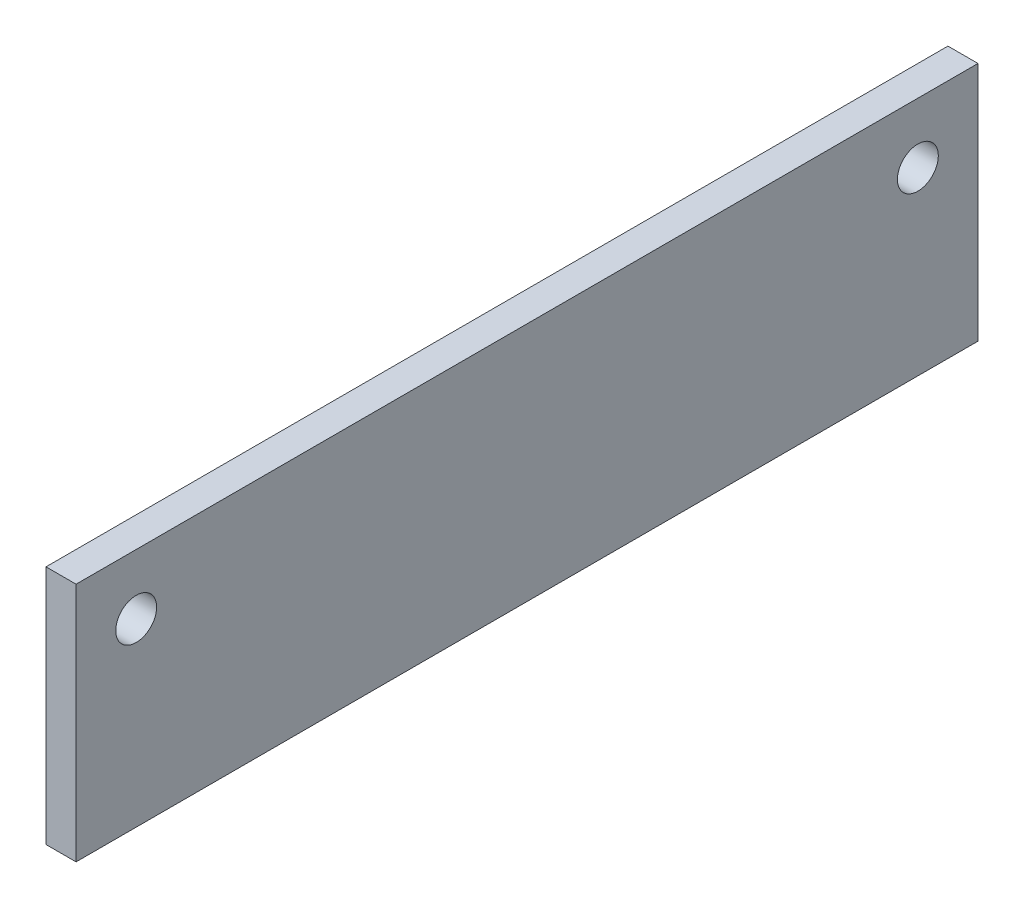
ISO-10303-21;
HEADER;
FILE_DESCRIPTION(('STEP AP214'),'2;1');
FILE_NAME('part.step','',(''),(''),'','','');
FILE_SCHEMA(('AUTOMOTIVE_DESIGN { 1 0 10303 214 1 1 1 1 }'));
ENDSEC;
DATA;
#1=APPLICATION_CONTEXT('core data for automotive mechanical design processes');
#2=APPLICATION_PROTOCOL_DEFINITION('international standard','automotive_design',2000,#1);
#3=PRODUCT_CONTEXT('',#1,'mechanical');
#4=PRODUCT('Part','Part','',(#3));
#5=PRODUCT_RELATED_PRODUCT_CATEGORY('part','',(#4));
#6=PRODUCT_DEFINITION_FORMATION('','',#4);
#7=PRODUCT_DEFINITION_CONTEXT('part definition',#1,'design');
#8=PRODUCT_DEFINITION('design','',#6,#7);
#9=PRODUCT_DEFINITION_SHAPE('','',#8);
#10=(LENGTH_UNIT() NAMED_UNIT(*) SI_UNIT(.MILLI.,.METRE.));
#11=(NAMED_UNIT(*) PLANE_ANGLE_UNIT() SI_UNIT($,.RADIAN.));
#12=(NAMED_UNIT(*) SI_UNIT($,.STERADIAN.) SOLID_ANGLE_UNIT());
#13=UNCERTAINTY_MEASURE_WITH_UNIT(LENGTH_MEASURE(1.E-05),#10,'distance_accuracy_value','');
#14=(GEOMETRIC_REPRESENTATION_CONTEXT(3) GLOBAL_UNCERTAINTY_ASSIGNED_CONTEXT((#13)) GLOBAL_UNIT_ASSIGNED_CONTEXT((#10,
#11,#12)) REPRESENTATION_CONTEXT('',''));
#15=CARTESIAN_POINT('',(0.,0.,0.));
#16=DIRECTION('',(0.,0.,1.));
#17=DIRECTION('',(1.,0.,0.));
#18=AXIS2_PLACEMENT_3D('',#15,#16,#17);
#19=CARTESIAN_POINT('',(2.5,-10.,0.));
#20=DIRECTION('',(0.,1.,0.));
#21=DIRECTION('',(0.,0.,1.));
#22=AXIS2_PLACEMENT_3D('',#19,#20,#21);
#23=PLANE('',#22);
#24=DIRECTION('',(0.,0.,-1.));
#25=VECTOR('',#24,1.);
#26=CARTESIAN_POINT('',(0.,-10.,0.));
#27=LINE('',#26,#25);
#28=CARTESIAN_POINT('',(0.,-10.,37.5));
#29=VERTEX_POINT('',#28);
#30=CARTESIAN_POINT('',(0.,-10.,-37.5));
#31=VERTEX_POINT('',#30);
#32=EDGE_CURVE('E105',#29,#31,#27,.T.);
#33=ORIENTED_EDGE('',*,*,#32,.T.);
#34=DIRECTION('',(-1.,0.,0.));
#35=VECTOR('',#34,1.);
#36=CARTESIAN_POINT('',(2.5,-10.,-37.5));
#37=LINE('',#36,#35);
#38=CARTESIAN_POINT('',(2.5,-10.,-37.5));
#39=VERTEX_POINT('',#38);
#40=EDGE_CURVE('E11',#39,#31,#37,.T.);
#41=ORIENTED_EDGE('',*,*,#40,.F.);
#42=DIRECTION('',(0.,0.,-1.));
#43=VECTOR('',#42,1.);
#44=CARTESIAN_POINT('',(2.5,-10.,0.));
#45=LINE('',#44,#43);
#46=CARTESIAN_POINT('',(2.5,-10.,37.5));
#47=VERTEX_POINT('',#46);
#48=EDGE_CURVE('E75',#47,#39,#45,.T.);
#49=ORIENTED_EDGE('',*,*,#48,.F.);
#50=DIRECTION('',(-1.,0.,0.));
#51=VECTOR('',#50,1.);
#52=CARTESIAN_POINT('',(2.5,-10.,37.5));
#53=LINE('',#52,#51);
#54=EDGE_CURVE('E101',#47,#29,#53,.T.);
#55=ORIENTED_EDGE('',*,*,#54,.T.);
#56=EDGE_LOOP('',(#33,#41,#49,#55));
#57=FACE_BOUND('',#56,.T.);
#58=ADVANCED_FACE('F35',(#57),#23,.F.);
#59=CARTESIAN_POINT('',(2.5,0.,-37.5));
#60=DIRECTION('',(0.,0.,-1.));
#61=DIRECTION('',(-1.,0.,0.));
#62=AXIS2_PLACEMENT_3D('',#59,#60,#61);
#63=PLANE('',#62);
#64=DIRECTION('',(0.,-1.,0.));
#65=VECTOR('',#64,1.);
#66=CARTESIAN_POINT('',(0.,0.,-37.5));
#67=LINE('',#66,#65);
#68=CARTESIAN_POINT('',(0.,10.,-37.5));
#69=VERTEX_POINT('',#68);
#70=EDGE_CURVE('E84',#69,#31,#67,.T.);
#71=ORIENTED_EDGE('',*,*,#70,.F.);
#72=DIRECTION('',(-1.,0.,0.));
#73=VECTOR('',#72,1.);
#74=CARTESIAN_POINT('',(2.5,10.,-37.5));
#75=LINE('',#74,#73);
#76=CARTESIAN_POINT('',(2.5,10.,-37.5));
#77=VERTEX_POINT('',#76);
#78=EDGE_CURVE('E44',#77,#69,#75,.T.);
#79=ORIENTED_EDGE('',*,*,#78,.F.);
#80=DIRECTION('',(0.,-1.,0.));
#81=VECTOR('',#80,1.);
#82=CARTESIAN_POINT('',(2.5,0.,-37.5));
#83=LINE('',#82,#81);
#84=EDGE_CURVE('E82',#77,#39,#83,.T.);
#85=ORIENTED_EDGE('',*,*,#84,.T.);
#86=ORIENTED_EDGE('',*,*,#40,.T.);
#87=EDGE_LOOP('',(#71,#79,#85,#86));
#88=FACE_BOUND('',#87,.T.);
#89=ADVANCED_FACE('F81',(#88),#63,.T.);
#90=CARTESIAN_POINT('',(2.5,10.,0.));
#91=DIRECTION('',(0.,1.,0.));
#92=DIRECTION('',(0.,0.,1.));
#93=AXIS2_PLACEMENT_3D('',#90,#91,#92);
#94=PLANE('',#93);
#95=DIRECTION('',(0.,0.,-1.));
#96=VECTOR('',#95,1.);
#97=CARTESIAN_POINT('',(0.,10.,0.));
#98=LINE('',#97,#96);
#99=CARTESIAN_POINT('',(0.,10.,37.5));
#100=VERTEX_POINT('',#99);
#101=EDGE_CURVE('E109',#100,#69,#98,.T.);
#102=ORIENTED_EDGE('',*,*,#101,.F.);
#103=DIRECTION('',(-1.,0.,0.));
#104=VECTOR('',#103,1.);
#105=CARTESIAN_POINT('',(2.5,10.,37.5));
#106=LINE('',#105,#104);
#107=CARTESIAN_POINT('',(2.5,10.,37.5));
#108=VERTEX_POINT('',#107);
#109=EDGE_CURVE('E67',#108,#100,#106,.T.);
#110=ORIENTED_EDGE('',*,*,#109,.F.);
#111=DIRECTION('',(0.,0.,-1.));
#112=VECTOR('',#111,1.);
#113=CARTESIAN_POINT('',(2.5,10.,0.));
#114=LINE('',#113,#112);
#115=EDGE_CURVE('E91',#108,#77,#114,.T.);
#116=ORIENTED_EDGE('',*,*,#115,.T.);
#117=ORIENTED_EDGE('',*,*,#78,.T.);
#118=EDGE_LOOP('',(#102,#110,#116,#117));
#119=FACE_BOUND('',#118,.T.);
#120=ADVANCED_FACE('F93',(#119),#94,.T.);
#121=CARTESIAN_POINT('',(2.5,0.,37.5));
#122=DIRECTION('',(0.,0.,-1.));
#123=DIRECTION('',(-1.,0.,0.));
#124=AXIS2_PLACEMENT_3D('',#121,#122,#123);
#125=PLANE('',#124);
#126=DIRECTION('',(0.,-1.,0.));
#127=VECTOR('',#126,1.);
#128=CARTESIAN_POINT('',(0.,0.,37.5));
#129=LINE('',#128,#127);
#130=EDGE_CURVE('E70',#100,#29,#129,.T.);
#131=ORIENTED_EDGE('',*,*,#130,.T.);
#132=ORIENTED_EDGE('',*,*,#54,.F.);
#133=DIRECTION('',(0.,-1.,0.));
#134=VECTOR('',#133,1.);
#135=CARTESIAN_POINT('',(2.5,0.,37.5));
#136=LINE('',#135,#134);
#137=EDGE_CURVE('E52',#108,#47,#136,.T.);
#138=ORIENTED_EDGE('',*,*,#137,.F.);
#139=ORIENTED_EDGE('',*,*,#109,.T.);
#140=EDGE_LOOP('',(#131,#132,#138,#139));
#141=FACE_BOUND('',#140,.T.);
#142=ADVANCED_FACE('F137',(#141),#125,.F.);
#143=CARTESIAN_POINT('',(2.5,4.99999999999999,-32.5));
#144=DIRECTION('',(-1.,0.,0.));
#145=DIRECTION('',(0.,0.,1.));
#146=AXIS2_PLACEMENT_3D('',#143,#144,#145);
#147=CYLINDRICAL_SURFACE('',#146,1.7);
#148=CARTESIAN_POINT('',(2.5,4.99999999999999,-32.5));
#149=DIRECTION('',(1.,0.,0.));
#150=DIRECTION('',(0.,0.,-1.));
#151=AXIS2_PLACEMENT_3D('',#148,#149,#150);
#152=CIRCLE('',#151,1.7);
#153=CARTESIAN_POINT('',(2.5,4.99999999999999,-34.2));
#154=VERTEX_POINT('',#153);
#155=EDGE_CURVE('E115',#154,#154,#152,.T.);
#156=ORIENTED_EDGE('',*,*,#155,.T.);
#157=EDGE_LOOP('',(#156));
#158=FACE_BOUND('',#157,.T.);
#159=CARTESIAN_POINT('',(0.,4.99999999999999,-32.5));
#160=DIRECTION('',(1.,0.,0.));
#161=DIRECTION('',(0.,0.,-1.));
#162=AXIS2_PLACEMENT_3D('',#159,#160,#161);
#163=CIRCLE('',#162,1.7);
#164=CARTESIAN_POINT('',(0.,4.99999999999999,-34.2));
#165=VERTEX_POINT('',#164);
#166=EDGE_CURVE('E102',#165,#165,#163,.T.);
#167=ORIENTED_EDGE('',*,*,#166,.F.);
#168=EDGE_LOOP('',(#167));
#169=FACE_BOUND('',#168,.T.);
#170=ADVANCED_FACE('F37',(#158,#169),#147,.F.);
#171=CARTESIAN_POINT('',(2.5,4.99999999999999,32.5));
#172=DIRECTION('',(-1.,0.,0.));
#173=DIRECTION('',(0.,0.,1.));
#174=AXIS2_PLACEMENT_3D('',#171,#172,#173);
#175=CYLINDRICAL_SURFACE('',#174,1.7);
#176=CARTESIAN_POINT('',(2.5,4.99999999999999,32.5));
#177=DIRECTION('',(1.,0.,0.));
#178=DIRECTION('',(0.,0.,-1.));
#179=AXIS2_PLACEMENT_3D('',#176,#177,#178);
#180=CIRCLE('',#179,1.7);
#181=CARTESIAN_POINT('',(2.5,4.99999999999999,30.8));
#182=VERTEX_POINT('',#181);
#183=EDGE_CURVE('E95',#182,#182,#180,.T.);
#184=ORIENTED_EDGE('',*,*,#183,.T.);
#185=EDGE_LOOP('',(#184));
#186=FACE_BOUND('',#185,.T.);
#187=CARTESIAN_POINT('',(0.,4.99999999999999,32.5));
#188=DIRECTION('',(1.,0.,0.));
#189=DIRECTION('',(0.,0.,-1.));
#190=AXIS2_PLACEMENT_3D('',#187,#188,#189);
#191=CIRCLE('',#190,1.7);
#192=CARTESIAN_POINT('',(0.,4.99999999999999,30.8));
#193=VERTEX_POINT('',#192);
#194=EDGE_CURVE('E112',#193,#193,#191,.T.);
#195=ORIENTED_EDGE('',*,*,#194,.F.);
#196=EDGE_LOOP('',(#195));
#197=FACE_BOUND('',#196,.T.);
#198=ADVANCED_FACE('F127',(#186,#197),#175,.F.);
#199=CARTESIAN_POINT('',(2.5,0.,0.));
#200=DIRECTION('',(1.,0.,0.));
#201=DIRECTION('',(0.,0.,-1.));
#202=AXIS2_PLACEMENT_3D('',#199,#200,#201);
#203=PLANE('',#202);
#204=ORIENTED_EDGE('',*,*,#155,.F.);
#205=EDGE_LOOP('',(#204));
#206=FACE_BOUND('',#205,.T.);
#207=ORIENTED_EDGE('',*,*,#48,.T.);
#208=ORIENTED_EDGE('',*,*,#84,.F.);
#209=ORIENTED_EDGE('',*,*,#115,.F.);
#210=ORIENTED_EDGE('',*,*,#137,.T.);
#211=EDGE_LOOP('',(#207,#208,#209,#210));
#212=FACE_BOUND('',#211,.T.);
#213=ORIENTED_EDGE('',*,*,#183,.F.);
#214=EDGE_LOOP('',(#213));
#215=FACE_BOUND('',#214,.T.);
#216=ADVANCED_FACE('F89',(#206,#212,#215),#203,.T.);
#217=CARTESIAN_POINT('',(0.,0.,0.));
#218=DIRECTION('',(1.,0.,0.));
#219=DIRECTION('',(0.,0.,-1.));
#220=AXIS2_PLACEMENT_3D('',#217,#218,#219);
#221=PLANE('',#220);
#222=ORIENTED_EDGE('',*,*,#166,.T.);
#223=EDGE_LOOP('',(#222));
#224=FACE_BOUND('',#223,.T.);
#225=ORIENTED_EDGE('',*,*,#32,.F.);
#226=ORIENTED_EDGE('',*,*,#130,.F.);
#227=ORIENTED_EDGE('',*,*,#101,.T.);
#228=ORIENTED_EDGE('',*,*,#70,.T.);
#229=EDGE_LOOP('',(#225,#226,#227,#228));
#230=FACE_BOUND('',#229,.T.);
#231=ORIENTED_EDGE('',*,*,#194,.T.);
#232=EDGE_LOOP('',(#231));
#233=FACE_BOUND('',#232,.T.);
#234=ADVANCED_FACE('F120',(#224,#230,#233),#221,.F.);
#235=CLOSED_SHELL('',(#58,#89,#120,#142,#170,#198,#216,#234));
#236=MANIFOLD_SOLID_BREP('B2',#235);
#237=ADVANCED_BREP_SHAPE_REPRESENTATION('',(#18,#236),#14);
#238=SHAPE_DEFINITION_REPRESENTATION(#9,#237);
ENDSEC;
END-ISO-10303-21;
